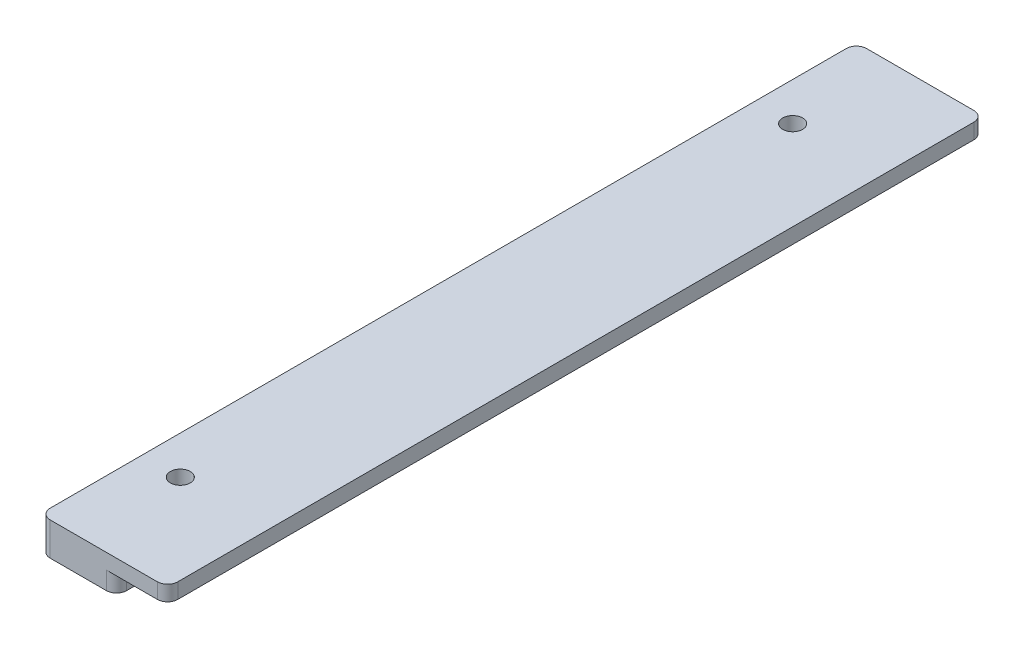
ISO-10303-21;
HEADER;
FILE_DESCRIPTION(('STEP AP214'),'2;1');
FILE_NAME('part.step','',(''),(''),'','','');
FILE_SCHEMA(('AUTOMOTIVE_DESIGN { 1 0 10303 214 1 1 1 1 }'));
ENDSEC;
DATA;
#1=APPLICATION_CONTEXT('core data for automotive mechanical design processes');
#2=APPLICATION_PROTOCOL_DEFINITION('international standard','automotive_design',2000,#1);
#3=PRODUCT_CONTEXT('',#1,'mechanical');
#4=PRODUCT('Part','Part','',(#3));
#5=PRODUCT_RELATED_PRODUCT_CATEGORY('part','',(#4));
#6=PRODUCT_DEFINITION_FORMATION('','',#4);
#7=PRODUCT_DEFINITION_CONTEXT('part definition',#1,'design');
#8=PRODUCT_DEFINITION('design','',#6,#7);
#9=PRODUCT_DEFINITION_SHAPE('','',#8);
#10=(LENGTH_UNIT() NAMED_UNIT(*) SI_UNIT(.MILLI.,.METRE.));
#11=(NAMED_UNIT(*) PLANE_ANGLE_UNIT() SI_UNIT($,.RADIAN.));
#12=(NAMED_UNIT(*) SI_UNIT($,.STERADIAN.) SOLID_ANGLE_UNIT());
#13=UNCERTAINTY_MEASURE_WITH_UNIT(LENGTH_MEASURE(1.E-05),#10,'distance_accuracy_value','');
#14=(GEOMETRIC_REPRESENTATION_CONTEXT(3) GLOBAL_UNCERTAINTY_ASSIGNED_CONTEXT((#13)) GLOBAL_UNIT_ASSIGNED_CONTEXT((#10,
#11,#12)) REPRESENTATION_CONTEXT('',''));
#15=CARTESIAN_POINT('',(0.,0.,0.));
#16=DIRECTION('',(0.,0.,1.));
#17=DIRECTION('',(1.,0.,0.));
#18=AXIS2_PLACEMENT_3D('',#15,#16,#17);
#19=CARTESIAN_POINT('',(15.,0.,160.));
#20=DIRECTION('',(0.,1.,0.));
#21=DIRECTION('',(-1.,0.,0.));
#22=AXIS2_PLACEMENT_3D('',#19,#20,#21);
#23=PLANE('',#22);
#24=CARTESIAN_POINT('',(7.5,0.,140.));
#25=DIRECTION('',(0.,-1.,0.));
#26=DIRECTION('',(0.,0.,-1.));
#27=AXIS2_PLACEMENT_3D('',#24,#25,#26);
#28=CIRCLE('',#27,1.95000000000001);
#29=CARTESIAN_POINT('',(7.5,0.,138.05));
#30=VERTEX_POINT('',#29);
#31=EDGE_CURVE('E210',#30,#30,#28,.T.);
#32=ORIENTED_EDGE('',*,*,#31,.F.);
#33=EDGE_LOOP('',(#32));
#34=FACE_BOUND('',#33,.T.);
#35=CARTESIAN_POINT('',(7.5,0.,20.));
#36=DIRECTION('',(0.,-1.,0.));
#37=DIRECTION('',(0.,0.,-1.));
#38=AXIS2_PLACEMENT_3D('',#35,#36,#37);
#39=CIRCLE('',#38,1.95);
#40=CARTESIAN_POINT('',(7.5,0.,18.05));
#41=VERTEX_POINT('',#40);
#42=EDGE_CURVE('E260',#41,#41,#39,.T.);
#43=ORIENTED_EDGE('',*,*,#42,.F.);
#44=EDGE_LOOP('',(#43));
#45=FACE_BOUND('',#44,.T.);
#46=DIRECTION('',(1.,0.,0.));
#47=VECTOR('',#46,1.);
#48=CARTESIAN_POINT('',(15.,0.,0.));
#49=LINE('',#48,#47);
#50=CARTESIAN_POINT('',(2.,0.,0.));
#51=VERTEX_POINT('',#50);
#52=CARTESIAN_POINT('',(13.,0.,0.));
#53=VERTEX_POINT('',#52);
#54=EDGE_CURVE('E201',#51,#53,#49,.T.);
#55=ORIENTED_EDGE('',*,*,#54,.T.);
#56=CARTESIAN_POINT('',(13.,0.,2.));
#57=DIRECTION('',(0.,1.,0.));
#58=DIRECTION('',(-1.,0.,0.));
#59=AXIS2_PLACEMENT_3D('',#56,#57,#58);
#60=CIRCLE('',#59,2.);
#61=CARTESIAN_POINT('',(15.,0.,2.));
#62=VERTEX_POINT('',#61);
#63=EDGE_CURVE('E163',#53,#62,#60,.F.);
#64=ORIENTED_EDGE('',*,*,#63,.T.);
#65=DIRECTION('',(0.,0.,-1.));
#66=VECTOR('',#65,1.);
#67=CARTESIAN_POINT('',(15.,0.,160.));
#68=LINE('',#67,#66);
#69=CARTESIAN_POINT('',(15.,0.,158.));
#70=VERTEX_POINT('',#69);
#71=EDGE_CURVE('E142',#70,#62,#68,.T.);
#72=ORIENTED_EDGE('',*,*,#71,.F.);
#73=CARTESIAN_POINT('',(13.,0.,158.));
#74=DIRECTION('',(0.,1.,0.));
#75=DIRECTION('',(-1.,0.,0.));
#76=AXIS2_PLACEMENT_3D('',#73,#74,#75);
#77=CIRCLE('',#76,2.);
#78=CARTESIAN_POINT('',(13.,0.,160.));
#79=VERTEX_POINT('',#78);
#80=EDGE_CURVE('E147',#70,#79,#77,.F.);
#81=ORIENTED_EDGE('',*,*,#80,.T.);
#82=DIRECTION('',(1.,0.,0.));
#83=VECTOR('',#82,1.);
#84=CARTESIAN_POINT('',(15.,0.,160.));
#85=LINE('',#84,#83);
#86=CARTESIAN_POINT('',(2.,0.,160.));
#87=VERTEX_POINT('',#86);
#88=EDGE_CURVE('E218',#87,#79,#85,.T.);
#89=ORIENTED_EDGE('',*,*,#88,.F.);
#90=CARTESIAN_POINT('',(2.,0.,158.));
#91=DIRECTION('',(0.,1.,0.));
#92=DIRECTION('',(-1.,0.,0.));
#93=AXIS2_PLACEMENT_3D('',#90,#91,#92);
#94=CIRCLE('',#93,2.);
#95=CARTESIAN_POINT('',(0.,0.,158.));
#96=VERTEX_POINT('',#95);
#97=EDGE_CURVE('E160',#87,#96,#94,.F.);
#98=ORIENTED_EDGE('',*,*,#97,.T.);
#99=DIRECTION('',(0.,0.,-1.));
#100=VECTOR('',#99,1.);
#101=CARTESIAN_POINT('',(0.,0.,160.));
#102=LINE('',#101,#100);
#103=CARTESIAN_POINT('',(0.,0.,2.));
#104=VERTEX_POINT('',#103);
#105=EDGE_CURVE('E219',#96,#104,#102,.T.);
#106=ORIENTED_EDGE('',*,*,#105,.T.);
#107=CARTESIAN_POINT('',(2.,0.,2.));
#108=DIRECTION('',(0.,1.,0.));
#109=DIRECTION('',(-1.,0.,0.));
#110=AXIS2_PLACEMENT_3D('',#107,#108,#109);
#111=CIRCLE('',#110,2.);
#112=EDGE_CURVE('E158',#104,#51,#111,.F.);
#113=ORIENTED_EDGE('',*,*,#112,.T.);
#114=EDGE_LOOP('',(#55,#64,#72,#81,#89,#98,#106,#113));
#115=FACE_BOUND('',#114,.T.);
#116=ADVANCED_FACE('F35',(#34,#45,#115),#23,.F.);
#117=CARTESIAN_POINT('',(15.,3.5,160.));
#118=DIRECTION('',(-1.,0.,0.));
#119=DIRECTION('',(0.,0.,1.));
#120=AXIS2_PLACEMENT_3D('',#117,#118,#119);
#121=PLANE('',#120);
#122=ORIENTED_EDGE('',*,*,#71,.T.);
#123=DIRECTION('',(0.,1.,0.));
#124=VECTOR('',#123,1.);
#125=CARTESIAN_POINT('',(15.,3.5,2.));
#126=LINE('',#125,#124);
#127=CARTESIAN_POINT('',(15.,3.5,2.));
#128=VERTEX_POINT('',#127);
#129=EDGE_CURVE('E141',#62,#128,#126,.T.);
#130=ORIENTED_EDGE('',*,*,#129,.T.);
#131=DIRECTION('',(0.,0.,-1.));
#132=VECTOR('',#131,1.);
#133=CARTESIAN_POINT('',(15.,3.5,160.));
#134=LINE('',#133,#132);
#135=CARTESIAN_POINT('',(15.,3.5,158.));
#136=VERTEX_POINT('',#135);
#137=EDGE_CURVE('E127',#136,#128,#134,.T.);
#138=ORIENTED_EDGE('',*,*,#137,.F.);
#139=DIRECTION('',(0.,1.,0.));
#140=VECTOR('',#139,1.);
#141=CARTESIAN_POINT('',(15.,3.5,158.));
#142=LINE('',#141,#140);
#143=EDGE_CURVE('E138',#136,#70,#142,.F.);
#144=ORIENTED_EDGE('',*,*,#143,.T.);
#145=EDGE_LOOP('',(#122,#130,#138,#144));
#146=FACE_BOUND('',#145,.T.);
#147=ADVANCED_FACE('F137',(#146),#121,.F.);
#148=CARTESIAN_POINT('',(25.,3.5,160.));
#149=DIRECTION('',(0.,1.,0.));
#150=DIRECTION('',(-1.,0.,0.));
#151=AXIS2_PLACEMENT_3D('',#148,#149,#150);
#152=PLANE('',#151);
#153=DIRECTION('',(0.,0.,-1.));
#154=VECTOR('',#153,1.);
#155=CARTESIAN_POINT('',(25.,3.5,160.));
#156=LINE('',#155,#154);
#157=CARTESIAN_POINT('',(25.,3.5,158.));
#158=VERTEX_POINT('',#157);
#159=CARTESIAN_POINT('',(25.,3.5,2.));
#160=VERTEX_POINT('',#159);
#161=EDGE_CURVE('E143',#158,#160,#156,.T.);
#162=ORIENTED_EDGE('',*,*,#161,.F.);
#163=CARTESIAN_POINT('',(23.,3.5,158.));
#164=DIRECTION('',(0.,1.,0.));
#165=DIRECTION('',(-1.,0.,0.));
#166=AXIS2_PLACEMENT_3D('',#163,#164,#165);
#167=CIRCLE('',#166,2.);
#168=CARTESIAN_POINT('',(23.,3.5,160.));
#169=VERTEX_POINT('',#168);
#170=EDGE_CURVE('E186',#158,#169,#167,.F.);
#171=ORIENTED_EDGE('',*,*,#170,.T.);
#172=DIRECTION('',(1.,0.,0.));
#173=VECTOR('',#172,1.);
#174=CARTESIAN_POINT('',(25.,3.5,160.));
#175=LINE('',#174,#173);
#176=CARTESIAN_POINT('',(13.,3.5,160.));
#177=VERTEX_POINT('',#176);
#178=EDGE_CURVE('E129',#177,#169,#175,.T.);
#179=ORIENTED_EDGE('',*,*,#178,.F.);
#180=CARTESIAN_POINT('',(13.,3.5,158.));
#181=DIRECTION('',(0.,1.,0.));
#182=DIRECTION('',(-1.,0.,0.));
#183=AXIS2_PLACEMENT_3D('',#180,#181,#182);
#184=CIRCLE('',#183,2.);
#185=EDGE_CURVE('E11',#177,#136,#184,.T.);
#186=ORIENTED_EDGE('',*,*,#185,.T.);
#187=ORIENTED_EDGE('',*,*,#137,.T.);
#188=CARTESIAN_POINT('',(13.,3.5,2.));
#189=DIRECTION('',(0.,1.,0.));
#190=DIRECTION('',(-1.,0.,0.));
#191=AXIS2_PLACEMENT_3D('',#188,#189,#190);
#192=CIRCLE('',#191,2.);
#193=CARTESIAN_POINT('',(13.,3.5,0.));
#194=VERTEX_POINT('',#193);
#195=EDGE_CURVE('E43',#128,#194,#192,.T.);
#196=ORIENTED_EDGE('',*,*,#195,.T.);
#197=DIRECTION('',(1.,0.,0.));
#198=VECTOR('',#197,1.);
#199=CARTESIAN_POINT('',(25.,3.5,0.));
#200=LINE('',#199,#198);
#201=CARTESIAN_POINT('',(23.,3.5,0.));
#202=VERTEX_POINT('',#201);
#203=EDGE_CURVE('E193',#194,#202,#200,.T.);
#204=ORIENTED_EDGE('',*,*,#203,.T.);
#205=CARTESIAN_POINT('',(23.,3.5,2.));
#206=DIRECTION('',(0.,1.,0.));
#207=DIRECTION('',(-1.,0.,0.));
#208=AXIS2_PLACEMENT_3D('',#205,#206,#207);
#209=CIRCLE('',#208,2.);
#210=EDGE_CURVE('E50',#202,#160,#209,.F.);
#211=ORIENTED_EDGE('',*,*,#210,.T.);
#212=EDGE_LOOP('',(#162,#171,#179,#186,#187,#196,#204,#211));
#213=FACE_BOUND('',#212,.T.);
#214=ADVANCED_FACE('F125',(#213),#152,.F.);
#215=CARTESIAN_POINT('',(25.,6.5,160.));
#216=DIRECTION('',(-1.,0.,0.));
#217=DIRECTION('',(0.,0.,1.));
#218=AXIS2_PLACEMENT_3D('',#215,#216,#217);
#219=PLANE('',#218);
#220=DIRECTION('',(0.,0.,-1.));
#221=VECTOR('',#220,1.);
#222=CARTESIAN_POINT('',(25.,6.5,160.));
#223=LINE('',#222,#221);
#224=CARTESIAN_POINT('',(25.,6.5,158.));
#225=VERTEX_POINT('',#224);
#226=CARTESIAN_POINT('',(25.,6.5,2.));
#227=VERTEX_POINT('',#226);
#228=EDGE_CURVE('E224',#225,#227,#223,.T.);
#229=ORIENTED_EDGE('',*,*,#228,.F.);
#230=DIRECTION('',(0.,1.,0.));
#231=VECTOR('',#230,1.);
#232=CARTESIAN_POINT('',(25.,6.5,158.));
#233=LINE('',#232,#231);
#234=EDGE_CURVE('E57',#225,#158,#233,.F.);
#235=ORIENTED_EDGE('',*,*,#234,.T.);
#236=ORIENTED_EDGE('',*,*,#161,.T.);
#237=DIRECTION('',(0.,1.,0.));
#238=VECTOR('',#237,1.);
#239=CARTESIAN_POINT('',(25.,6.5,2.));
#240=LINE('',#239,#238);
#241=EDGE_CURVE('E181',#160,#227,#240,.T.);
#242=ORIENTED_EDGE('',*,*,#241,.T.);
#243=EDGE_LOOP('',(#229,#235,#236,#242));
#244=FACE_BOUND('',#243,.T.);
#245=ADVANCED_FACE('F228',(#244),#219,.F.);
#246=CARTESIAN_POINT('',(0.,6.5,160.));
#247=DIRECTION('',(0.,-1.,0.));
#248=DIRECTION('',(0.,0.,-1.));
#249=AXIS2_PLACEMENT_3D('',#246,#247,#248);
#250=PLANE('',#249);
#251=CARTESIAN_POINT('',(7.5,6.5,140.));
#252=DIRECTION('',(0.,-1.,0.));
#253=DIRECTION('',(0.,0.,-1.));
#254=AXIS2_PLACEMENT_3D('',#251,#252,#253);
#255=CIRCLE('',#254,1.95000000000001);
#256=CARTESIAN_POINT('',(7.5,6.5,138.05));
#257=VERTEX_POINT('',#256);
#258=EDGE_CURVE('E205',#257,#257,#255,.F.);
#259=ORIENTED_EDGE('',*,*,#258,.F.);
#260=EDGE_LOOP('',(#259));
#261=FACE_BOUND('',#260,.T.);
#262=CARTESIAN_POINT('',(7.5,6.5,20.));
#263=DIRECTION('',(0.,-1.,0.));
#264=DIRECTION('',(0.,0.,-1.));
#265=AXIS2_PLACEMENT_3D('',#262,#263,#264);
#266=CIRCLE('',#265,1.95);
#267=CARTESIAN_POINT('',(7.5,6.5,18.05));
#268=VERTEX_POINT('',#267);
#269=EDGE_CURVE('E257',#268,#268,#266,.F.);
#270=ORIENTED_EDGE('',*,*,#269,.F.);
#271=EDGE_LOOP('',(#270));
#272=FACE_BOUND('',#271,.T.);
#273=DIRECTION('',(-1.,0.,0.));
#274=VECTOR('',#273,1.);
#275=CARTESIAN_POINT('',(0.,6.5,160.));
#276=LINE('',#275,#274);
#277=CARTESIAN_POINT('',(23.,6.5,160.));
#278=VERTEX_POINT('',#277);
#279=CARTESIAN_POINT('',(2.,6.5,160.));
#280=VERTEX_POINT('',#279);
#281=EDGE_CURVE('E213',#278,#280,#276,.T.);
#282=ORIENTED_EDGE('',*,*,#281,.F.);
#283=CARTESIAN_POINT('',(23.,6.5,158.));
#284=DIRECTION('',(0.,-1.,0.));
#285=DIRECTION('',(0.,0.,-1.));
#286=AXIS2_PLACEMENT_3D('',#283,#284,#285);
#287=CIRCLE('',#286,2.);
#288=EDGE_CURVE('E179',#278,#225,#287,.F.);
#289=ORIENTED_EDGE('',*,*,#288,.T.);
#290=ORIENTED_EDGE('',*,*,#228,.T.);
#291=CARTESIAN_POINT('',(23.,6.5,2.));
#292=DIRECTION('',(0.,-1.,0.));
#293=DIRECTION('',(0.,0.,-1.));
#294=AXIS2_PLACEMENT_3D('',#291,#292,#293);
#295=CIRCLE('',#294,2.);
#296=CARTESIAN_POINT('',(23.,6.5,0.));
#297=VERTEX_POINT('',#296);
#298=EDGE_CURVE('E175',#227,#297,#295,.F.);
#299=ORIENTED_EDGE('',*,*,#298,.T.);
#300=DIRECTION('',(-1.,0.,0.));
#301=VECTOR('',#300,1.);
#302=CARTESIAN_POINT('',(0.,6.5,0.));
#303=LINE('',#302,#301);
#304=CARTESIAN_POINT('',(2.,6.5,0.));
#305=VERTEX_POINT('',#304);
#306=EDGE_CURVE('E207',#297,#305,#303,.T.);
#307=ORIENTED_EDGE('',*,*,#306,.T.);
#308=CARTESIAN_POINT('',(2.,6.5,2.));
#309=DIRECTION('',(0.,-1.,0.));
#310=DIRECTION('',(0.,0.,-1.));
#311=AXIS2_PLACEMENT_3D('',#308,#309,#310);
#312=CIRCLE('',#311,2.);
#313=CARTESIAN_POINT('',(0.,6.5,2.));
#314=VERTEX_POINT('',#313);
#315=EDGE_CURVE('E173',#305,#314,#312,.F.);
#316=ORIENTED_EDGE('',*,*,#315,.T.);
#317=DIRECTION('',(0.,0.,-1.));
#318=VECTOR('',#317,1.);
#319=CARTESIAN_POINT('',(0.,6.5,160.));
#320=LINE('',#319,#318);
#321=CARTESIAN_POINT('',(0.,6.5,158.));
#322=VERTEX_POINT('',#321);
#323=EDGE_CURVE('E221',#322,#314,#320,.T.);
#324=ORIENTED_EDGE('',*,*,#323,.F.);
#325=CARTESIAN_POINT('',(2.,6.5,158.));
#326=DIRECTION('',(0.,-1.,0.));
#327=DIRECTION('',(0.,0.,-1.));
#328=AXIS2_PLACEMENT_3D('',#325,#326,#327);
#329=CIRCLE('',#328,2.);
#330=EDGE_CURVE('E177',#322,#280,#329,.F.);
#331=ORIENTED_EDGE('',*,*,#330,.T.);
#332=EDGE_LOOP('',(#282,#289,#290,#299,#307,#316,#324,#331));
#333=FACE_BOUND('',#332,.T.);
#334=ADVANCED_FACE('F236',(#261,#272,#333),#250,.F.);
#335=CARTESIAN_POINT('',(0.,0.,160.));
#336=DIRECTION('',(1.,0.,0.));
#337=DIRECTION('',(0.,0.,-1.));
#338=AXIS2_PLACEMENT_3D('',#335,#336,#337);
#339=PLANE('',#338);
#340=ORIENTED_EDGE('',*,*,#105,.F.);
#341=DIRECTION('',(0.,-1.,0.));
#342=VECTOR('',#341,1.);
#343=CARTESIAN_POINT('',(0.,0.,158.));
#344=LINE('',#343,#342);
#345=EDGE_CURVE('E191',#96,#322,#344,.F.);
#346=ORIENTED_EDGE('',*,*,#345,.T.);
#347=ORIENTED_EDGE('',*,*,#323,.T.);
#348=DIRECTION('',(0.,-1.,0.));
#349=VECTOR('',#348,1.);
#350=CARTESIAN_POINT('',(0.,0.,2.));
#351=LINE('',#350,#349);
#352=EDGE_CURVE('E188',#314,#104,#351,.T.);
#353=ORIENTED_EDGE('',*,*,#352,.T.);
#354=EDGE_LOOP('',(#340,#346,#347,#353));
#355=FACE_BOUND('',#354,.T.);
#356=ADVANCED_FACE('F244',(#355),#339,.F.);
#357=CARTESIAN_POINT('',(0.,0.,160.));
#358=DIRECTION('',(0.,0.,-1.));
#359=DIRECTION('',(-1.,0.,0.));
#360=AXIS2_PLACEMENT_3D('',#357,#358,#359);
#361=PLANE('',#360);
#362=ORIENTED_EDGE('',*,*,#88,.T.);
#363=DIRECTION('',(0.,1.,0.));
#364=VECTOR('',#363,1.);
#365=CARTESIAN_POINT('',(13.,0.,160.));
#366=LINE('',#365,#364);
#367=EDGE_CURVE('E171',#79,#177,#366,.T.);
#368=ORIENTED_EDGE('',*,*,#367,.T.);
#369=ORIENTED_EDGE('',*,*,#178,.T.);
#370=DIRECTION('',(0.,1.,0.));
#371=VECTOR('',#370,1.);
#372=CARTESIAN_POINT('',(23.,0.,160.));
#373=LINE('',#372,#371);
#374=EDGE_CURVE('E168',#169,#278,#373,.T.);
#375=ORIENTED_EDGE('',*,*,#374,.T.);
#376=ORIENTED_EDGE('',*,*,#281,.T.);
#377=DIRECTION('',(0.,-1.,0.));
#378=VECTOR('',#377,1.);
#379=CARTESIAN_POINT('',(2.,0.,160.));
#380=LINE('',#379,#378);
#381=EDGE_CURVE('E165',#280,#87,#380,.T.);
#382=ORIENTED_EDGE('',*,*,#381,.T.);
#383=EDGE_LOOP('',(#362,#368,#369,#375,#376,#382));
#384=FACE_BOUND('',#383,.T.);
#385=ADVANCED_FACE('F252',(#384),#361,.F.);
#386=CARTESIAN_POINT('',(0.,0.,0.));
#387=DIRECTION('',(0.,0.,-1.));
#388=DIRECTION('',(-1.,0.,0.));
#389=AXIS2_PLACEMENT_3D('',#386,#387,#388);
#390=PLANE('',#389);
#391=ORIENTED_EDGE('',*,*,#203,.F.);
#392=DIRECTION('',(0.,1.,0.));
#393=VECTOR('',#392,1.);
#394=CARTESIAN_POINT('',(13.,0.,0.));
#395=LINE('',#394,#393);
#396=EDGE_CURVE('E156',#194,#53,#395,.F.);
#397=ORIENTED_EDGE('',*,*,#396,.T.);
#398=ORIENTED_EDGE('',*,*,#54,.F.);
#399=DIRECTION('',(0.,-1.,0.));
#400=VECTOR('',#399,1.);
#401=CARTESIAN_POINT('',(2.,6.5,0.));
#402=LINE('',#401,#400);
#403=EDGE_CURVE('E149',#51,#305,#402,.F.);
#404=ORIENTED_EDGE('',*,*,#403,.T.);
#405=ORIENTED_EDGE('',*,*,#306,.F.);
#406=DIRECTION('',(0.,1.,0.));
#407=VECTOR('',#406,1.);
#408=CARTESIAN_POINT('',(23.,3.5,0.));
#409=LINE('',#408,#407);
#410=EDGE_CURVE('E154',#297,#202,#409,.F.);
#411=ORIENTED_EDGE('',*,*,#410,.T.);
#412=EDGE_LOOP('',(#391,#397,#398,#404,#405,#411));
#413=FACE_BOUND('',#412,.T.);
#414=ADVANCED_FACE('F200',(#413),#390,.T.);
#415=CARTESIAN_POINT('',(7.5,6.501,20.));
#416=DIRECTION('',(0.,-1.,0.));
#417=DIRECTION('',(0.,0.,-1.));
#418=AXIS2_PLACEMENT_3D('',#415,#416,#417);
#419=CYLINDRICAL_SURFACE('',#418,1.95);
#420=ORIENTED_EDGE('',*,*,#42,.T.);
#421=EDGE_LOOP('',(#420));
#422=FACE_BOUND('',#421,.T.);
#423=ORIENTED_EDGE('',*,*,#269,.T.);
#424=EDGE_LOOP('',(#423));
#425=FACE_BOUND('',#424,.T.);
#426=ADVANCED_FACE('F274',(#422,#425),#419,.F.);
#427=CARTESIAN_POINT('',(7.5,6.501,140.));
#428=DIRECTION('',(0.,-1.,0.));
#429=DIRECTION('',(0.,0.,-1.));
#430=AXIS2_PLACEMENT_3D('',#427,#428,#429);
#431=CYLINDRICAL_SURFACE('',#430,1.95000000000001);
#432=ORIENTED_EDGE('',*,*,#31,.T.);
#433=EDGE_LOOP('',(#432));
#434=FACE_BOUND('',#433,.T.);
#435=ORIENTED_EDGE('',*,*,#258,.T.);
#436=EDGE_LOOP('',(#435));
#437=FACE_BOUND('',#436,.T.);
#438=ADVANCED_FACE('F266',(#434,#437),#431,.F.);
#439=CARTESIAN_POINT('',(13.,3.5,2.));
#440=DIRECTION('',(0.,-1.,0.));
#441=DIRECTION('',(0.,0.,-1.));
#442=AXIS2_PLACEMENT_3D('',#439,#440,#441);
#443=CYLINDRICAL_SURFACE('',#442,2.);
#444=ORIENTED_EDGE('',*,*,#63,.F.);
#445=ORIENTED_EDGE('',*,*,#396,.F.);
#446=ORIENTED_EDGE('',*,*,#195,.F.);
#447=ORIENTED_EDGE('',*,*,#129,.F.);
#448=EDGE_LOOP('',(#444,#445,#446,#447));
#449=FACE_BOUND('',#448,.T.);
#450=ADVANCED_FACE('F196',(#449),#443,.T.);
#451=CARTESIAN_POINT('',(13.,0.,158.));
#452=DIRECTION('',(0.,1.,0.));
#453=DIRECTION('',(0.,0.,1.));
#454=AXIS2_PLACEMENT_3D('',#451,#452,#453);
#455=CYLINDRICAL_SURFACE('',#454,2.);
#456=ORIENTED_EDGE('',*,*,#80,.F.);
#457=ORIENTED_EDGE('',*,*,#143,.F.);
#458=ORIENTED_EDGE('',*,*,#185,.F.);
#459=ORIENTED_EDGE('',*,*,#367,.F.);
#460=EDGE_LOOP('',(#456,#457,#458,#459));
#461=FACE_BOUND('',#460,.T.);
#462=ADVANCED_FACE('F146',(#461),#455,.T.);
#463=CARTESIAN_POINT('',(23.,0.,158.));
#464=DIRECTION('',(0.,1.,0.));
#465=DIRECTION('',(0.,0.,1.));
#466=AXIS2_PLACEMENT_3D('',#463,#464,#465);
#467=CYLINDRICAL_SURFACE('',#466,2.);
#468=ORIENTED_EDGE('',*,*,#170,.F.);
#469=ORIENTED_EDGE('',*,*,#234,.F.);
#470=ORIENTED_EDGE('',*,*,#288,.F.);
#471=ORIENTED_EDGE('',*,*,#374,.F.);
#472=EDGE_LOOP('',(#468,#469,#470,#471));
#473=FACE_BOUND('',#472,.T.);
#474=ADVANCED_FACE('F300',(#473),#467,.T.);
#475=CARTESIAN_POINT('',(2.,0.,158.));
#476=DIRECTION('',(0.,-1.,0.));
#477=DIRECTION('',(0.,0.,-1.));
#478=AXIS2_PLACEMENT_3D('',#475,#476,#477);
#479=CYLINDRICAL_SURFACE('',#478,2.);
#480=ORIENTED_EDGE('',*,*,#330,.F.);
#481=ORIENTED_EDGE('',*,*,#345,.F.);
#482=ORIENTED_EDGE('',*,*,#97,.F.);
#483=ORIENTED_EDGE('',*,*,#381,.F.);
#484=EDGE_LOOP('',(#480,#481,#482,#483));
#485=FACE_BOUND('',#484,.T.);
#486=ADVANCED_FACE('F247',(#485),#479,.T.);
#487=CARTESIAN_POINT('',(23.,6.5,2.));
#488=DIRECTION('',(0.,-1.,0.));
#489=DIRECTION('',(0.,0.,-1.));
#490=AXIS2_PLACEMENT_3D('',#487,#488,#489);
#491=CYLINDRICAL_SURFACE('',#490,2.);
#492=ORIENTED_EDGE('',*,*,#210,.F.);
#493=ORIENTED_EDGE('',*,*,#410,.F.);
#494=ORIENTED_EDGE('',*,*,#298,.F.);
#495=ORIENTED_EDGE('',*,*,#241,.F.);
#496=EDGE_LOOP('',(#492,#493,#494,#495));
#497=FACE_BOUND('',#496,.T.);
#498=ADVANCED_FACE('F231',(#497),#491,.T.);
#499=CARTESIAN_POINT('',(2.,0.,2.));
#500=DIRECTION('',(0.,1.,0.));
#501=DIRECTION('',(0.,0.,1.));
#502=AXIS2_PLACEMENT_3D('',#499,#500,#501);
#503=CYLINDRICAL_SURFACE('',#502,2.);
#504=ORIENTED_EDGE('',*,*,#315,.F.);
#505=ORIENTED_EDGE('',*,*,#403,.F.);
#506=ORIENTED_EDGE('',*,*,#112,.F.);
#507=ORIENTED_EDGE('',*,*,#352,.F.);
#508=EDGE_LOOP('',(#504,#505,#506,#507));
#509=FACE_BOUND('',#508,.T.);
#510=ADVANCED_FACE('F37',(#509),#503,.T.);
#511=CLOSED_SHELL('',(#116,#147,#214,#245,#334,#356,#385,#414,#426,#438,#450,#462,#474,#486,
#498,#510));
#512=MANIFOLD_SOLID_BREP('B2',#511);
#513=ADVANCED_BREP_SHAPE_REPRESENTATION('',(#18,#512),#14);
#514=SHAPE_DEFINITION_REPRESENTATION(#9,#513);
ENDSEC;
END-ISO-10303-21;
